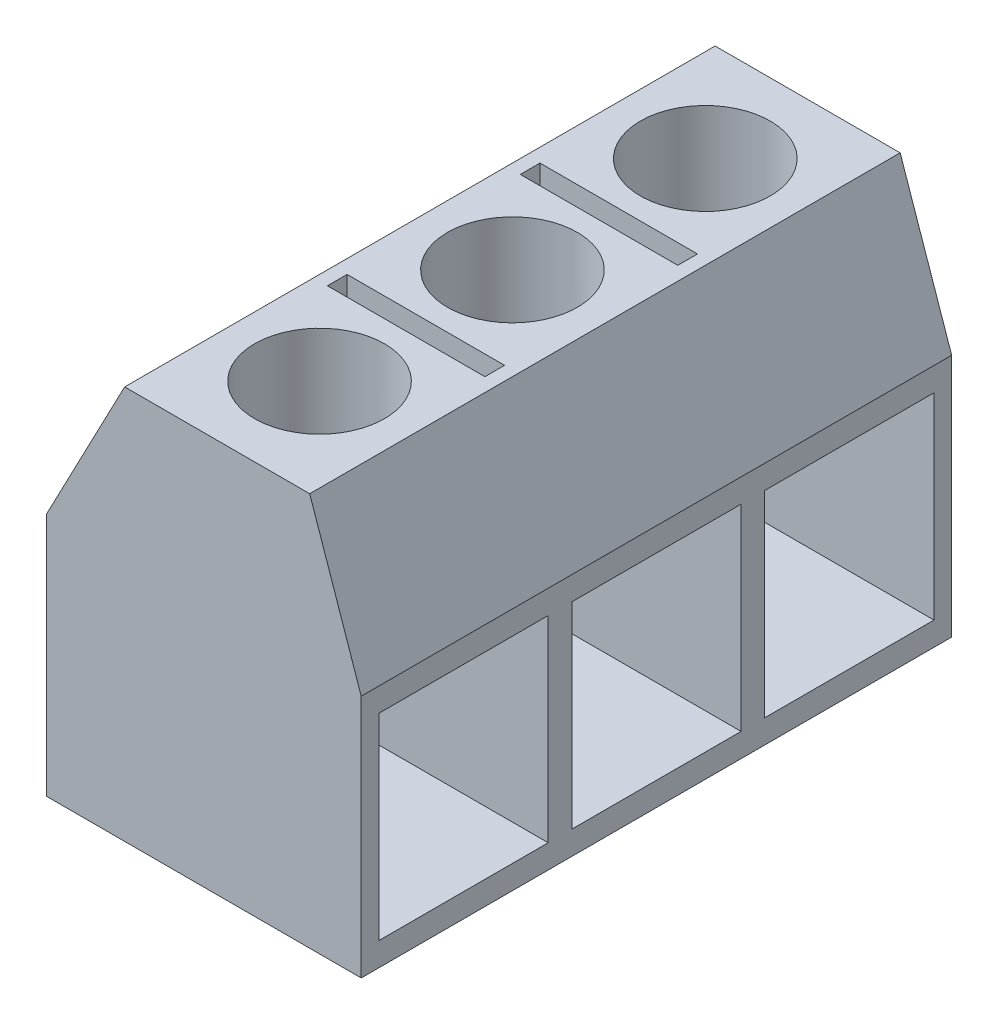
ISO-10303-21;
HEADER;
FILE_DESCRIPTION(('STEP AP214'),'2;1');
FILE_NAME('part.step','',(''),(''),'','','');
FILE_SCHEMA(('AUTOMOTIVE_DESIGN { 1 0 10303 214 1 1 1 1 }'));
ENDSEC;
DATA;
#1=APPLICATION_CONTEXT('core data for automotive mechanical design processes');
#2=APPLICATION_PROTOCOL_DEFINITION('international standard','automotive_design',2000,#1);
#3=PRODUCT_CONTEXT('',#1,'mechanical');
#4=PRODUCT('Part','Part','',(#3));
#5=PRODUCT_RELATED_PRODUCT_CATEGORY('part','',(#4));
#6=PRODUCT_DEFINITION_FORMATION('','',#4);
#7=PRODUCT_DEFINITION_CONTEXT('part definition',#1,'design');
#8=PRODUCT_DEFINITION('design','',#6,#7);
#9=PRODUCT_DEFINITION_SHAPE('','',#8);
#10=(LENGTH_UNIT() NAMED_UNIT(*) SI_UNIT(.MILLI.,.METRE.));
#11=(NAMED_UNIT(*) PLANE_ANGLE_UNIT() SI_UNIT($,.RADIAN.));
#12=(NAMED_UNIT(*) SI_UNIT($,.STERADIAN.) SOLID_ANGLE_UNIT());
#13=UNCERTAINTY_MEASURE_WITH_UNIT(LENGTH_MEASURE(1.E-05),#10,'distance_accuracy_value','');
#14=(GEOMETRIC_REPRESENTATION_CONTEXT(3) GLOBAL_UNCERTAINTY_ASSIGNED_CONTEXT((#13)) GLOBAL_UNIT_ASSIGNED_CONTEXT((#10,
#11,#12)) REPRESENTATION_CONTEXT('',''));
#15=CARTESIAN_POINT('',(0.,0.,0.));
#16=DIRECTION('',(0.,0.,1.));
#17=DIRECTION('',(1.,0.,0.));
#18=AXIS2_PLACEMENT_3D('',#15,#16,#17);
#19=CARTESIAN_POINT('',(-3.80327868852459,6.2,15.));
#20=DIRECTION('',(1.,0.,0.));
#21=DIRECTION('',(0.,1.,0.));
#22=AXIS2_PLACEMENT_3D('',#19,#20,#21);
#23=PLANE('',#22);
#24=DIRECTION('',(0.,-1.,0.));
#25=VECTOR('',#24,1.);
#26=CARTESIAN_POINT('',(-3.80327868852459,6.2,0.));
#27=LINE('',#26,#25);
#28=CARTESIAN_POINT('',(-3.80327868852459,6.2,0.));
#29=VERTEX_POINT('',#28);
#30=CARTESIAN_POINT('',(-3.80327868852458,0.,0.));
#31=VERTEX_POINT('',#30);
#32=EDGE_CURVE('E364',#29,#31,#27,.T.);
#33=ORIENTED_EDGE('',*,*,#32,.T.);
#34=DIRECTION('',(0.,0.,-1.));
#35=VECTOR('',#34,1.);
#36=CARTESIAN_POINT('',(-3.80327868852458,0.,15.));
#37=LINE('',#36,#35);
#38=CARTESIAN_POINT('',(-3.80327868852458,0.,15.));
#39=VERTEX_POINT('',#38);
#40=EDGE_CURVE('E11',#39,#31,#37,.T.);
#41=ORIENTED_EDGE('',*,*,#40,.F.);
#42=DIRECTION('',(0.,-1.,0.));
#43=VECTOR('',#42,1.);
#44=CARTESIAN_POINT('',(-3.80327868852459,6.2,15.));
#45=LINE('',#44,#43);
#46=CARTESIAN_POINT('',(-3.80327868852459,6.2,15.));
#47=VERTEX_POINT('',#46);
#48=EDGE_CURVE('E461',#47,#39,#45,.T.);
#49=ORIENTED_EDGE('',*,*,#48,.F.);
#50=DIRECTION('',(0.,0.,-1.));
#51=VECTOR('',#50,1.);
#52=CARTESIAN_POINT('',(-3.80327868852459,6.2,15.));
#53=LINE('',#52,#51);
#54=EDGE_CURVE('E481',#47,#29,#53,.T.);
#55=ORIENTED_EDGE('',*,*,#54,.T.);
#56=EDGE_LOOP('',(#33,#41,#49,#55));
#57=FACE_BOUND('',#56,.T.);
#58=ADVANCED_FACE('F47',(#57),#23,.F.);
#59=CARTESIAN_POINT('',(-3.80327868852458,0.,15.));
#60=DIRECTION('',(0.,1.,0.));
#61=DIRECTION('',(0.,0.,1.));
#62=AXIS2_PLACEMENT_3D('',#59,#60,#61);
#63=PLANE('',#62);
#64=DIRECTION('',(1.,0.,0.));
#65=VECTOR('',#64,1.);
#66=CARTESIAN_POINT('',(-3.80327868852458,0.,0.));
#67=LINE('',#66,#65);
#68=CARTESIAN_POINT('',(4.19672131147542,0.,0.));
#69=VERTEX_POINT('',#68);
#70=EDGE_CURVE('E485',#31,#69,#67,.T.);
#71=ORIENTED_EDGE('',*,*,#70,.T.);
#72=DIRECTION('',(0.,0.,-1.));
#73=VECTOR('',#72,1.);
#74=CARTESIAN_POINT('',(4.19672131147542,0.,15.));
#75=LINE('',#74,#73);
#76=CARTESIAN_POINT('',(4.19672131147542,0.,15.));
#77=VERTEX_POINT('',#76);
#78=EDGE_CURVE('E56',#77,#69,#75,.T.);
#79=ORIENTED_EDGE('',*,*,#78,.F.);
#80=DIRECTION('',(1.,0.,0.));
#81=VECTOR('',#80,1.);
#82=CARTESIAN_POINT('',(-3.80327868852458,0.,15.));
#83=LINE('',#82,#81);
#84=EDGE_CURVE('E465',#39,#77,#83,.T.);
#85=ORIENTED_EDGE('',*,*,#84,.F.);
#86=ORIENTED_EDGE('',*,*,#40,.T.);
#87=EDGE_LOOP('',(#71,#79,#85,#86));
#88=FACE_BOUND('',#87,.T.);
#89=ADVANCED_FACE('F549',(#88),#63,.F.);
#90=CARTESIAN_POINT('',(4.19672131147542,0.,15.));
#91=DIRECTION('',(-1.,0.,0.));
#92=DIRECTION('',(0.,0.,1.));
#93=AXIS2_PLACEMENT_3D('',#90,#91,#92);
#94=PLANE('',#93);
#95=DIRECTION('',(0.,0.,1.));
#96=VECTOR('',#95,1.);
#97=CARTESIAN_POINT('',(4.19672131147542,5.6,14.55));
#98=LINE('',#97,#96);
#99=CARTESIAN_POINT('',(4.19672131147542,5.6,10.25));
#100=VERTEX_POINT('',#99);
#101=CARTESIAN_POINT('',(4.19672131147542,5.6,14.55));
#102=VERTEX_POINT('',#101);
#103=EDGE_CURVE('E260',#100,#102,#98,.T.);
#104=ORIENTED_EDGE('',*,*,#103,.F.);
#105=DIRECTION('',(0.,1.,0.));
#106=VECTOR('',#105,1.);
#107=CARTESIAN_POINT('',(4.19672131147542,5.6,10.25));
#108=LINE('',#107,#106);
#109=CARTESIAN_POINT('',(4.19672131147542,0.599999999999999,10.25));
#110=VERTEX_POINT('',#109);
#111=EDGE_CURVE('E64',#110,#100,#108,.T.);
#112=ORIENTED_EDGE('',*,*,#111,.F.);
#113=DIRECTION('',(0.,0.,-1.));
#114=VECTOR('',#113,1.);
#115=CARTESIAN_POINT('',(4.19672131147542,0.599999999999999,14.55));
#116=LINE('',#115,#114);
#117=CARTESIAN_POINT('',(4.19672131147542,0.599999999999999,14.55));
#118=VERTEX_POINT('',#117);
#119=EDGE_CURVE('E246',#118,#110,#116,.T.);
#120=ORIENTED_EDGE('',*,*,#119,.F.);
#121=DIRECTION('',(0.,-1.,0.));
#122=VECTOR('',#121,1.);
#123=CARTESIAN_POINT('',(4.19672131147542,5.6,14.55));
#124=LINE('',#123,#122);
#125=EDGE_CURVE('E251',#102,#118,#124,.T.);
#126=ORIENTED_EDGE('',*,*,#125,.F.);
#127=EDGE_LOOP('',(#104,#112,#120,#126));
#128=FACE_BOUND('',#127,.T.);
#129=DIRECTION('',(0.,1.,0.));
#130=VECTOR('',#129,1.);
#131=CARTESIAN_POINT('',(4.19672131147542,5.6,5.35));
#132=LINE('',#131,#130);
#133=CARTESIAN_POINT('',(4.19672131147542,0.6,5.35));
#134=VERTEX_POINT('',#133);
#135=CARTESIAN_POINT('',(4.19672131147542,5.6,5.35));
#136=VERTEX_POINT('',#135);
#137=EDGE_CURVE('E296',#134,#136,#132,.T.);
#138=ORIENTED_EDGE('',*,*,#137,.F.);
#139=DIRECTION('',(0.,0.,-1.));
#140=VECTOR('',#139,1.);
#141=CARTESIAN_POINT('',(4.19672131147542,0.599999999999999,9.65));
#142=LINE('',#141,#140);
#143=CARTESIAN_POINT('',(4.19672131147542,0.599999999999999,9.65));
#144=VERTEX_POINT('',#143);
#145=EDGE_CURVE('E72',#144,#134,#142,.T.);
#146=ORIENTED_EDGE('',*,*,#145,.F.);
#147=DIRECTION('',(0.,-1.,0.));
#148=VECTOR('',#147,1.);
#149=CARTESIAN_POINT('',(4.19672131147542,5.6,9.65));
#150=LINE('',#149,#148);
#151=CARTESIAN_POINT('',(4.19672131147542,5.6,9.65));
#152=VERTEX_POINT('',#151);
#153=EDGE_CURVE('E281',#152,#144,#150,.T.);
#154=ORIENTED_EDGE('',*,*,#153,.F.);
#155=DIRECTION('',(0.,0.,1.));
#156=VECTOR('',#155,1.);
#157=CARTESIAN_POINT('',(4.19672131147542,5.6,9.65));
#158=LINE('',#157,#156);
#159=EDGE_CURVE('E301',#136,#152,#158,.T.);
#160=ORIENTED_EDGE('',*,*,#159,.F.);
#161=EDGE_LOOP('',(#138,#146,#154,#160));
#162=FACE_BOUND('',#161,.T.);
#163=DIRECTION('',(0.,1.,0.));
#164=VECTOR('',#163,1.);
#165=CARTESIAN_POINT('',(4.19672131147542,5.6,0.449999999999996));
#166=LINE('',#165,#164);
#167=CARTESIAN_POINT('',(4.19672131147542,0.599999999999999,0.449999999999996));
#168=VERTEX_POINT('',#167);
#169=CARTESIAN_POINT('',(4.19672131147542,5.6,0.449999999999996));
#170=VERTEX_POINT('',#169);
#171=EDGE_CURVE('E338',#168,#170,#166,.T.);
#172=ORIENTED_EDGE('',*,*,#171,.F.);
#173=DIRECTION('',(0.,0.,-1.));
#174=VECTOR('',#173,1.);
#175=CARTESIAN_POINT('',(4.19672131147542,0.599999999999999,4.75));
#176=LINE('',#175,#174);
#177=CARTESIAN_POINT('',(4.19672131147542,0.599999999999999,4.75));
#178=VERTEX_POINT('',#177);
#179=EDGE_CURVE('E335',#178,#168,#176,.T.);
#180=ORIENTED_EDGE('',*,*,#179,.F.);
#181=DIRECTION('',(0.,-1.,0.));
#182=VECTOR('',#181,1.);
#183=CARTESIAN_POINT('',(4.19672131147542,5.6,4.75));
#184=LINE('',#183,#182);
#185=CARTESIAN_POINT('',(4.19672131147542,5.6,4.75));
#186=VERTEX_POINT('',#185);
#187=EDGE_CURVE('E322',#186,#178,#184,.T.);
#188=ORIENTED_EDGE('',*,*,#187,.F.);
#189=DIRECTION('',(0.,0.,1.));
#190=VECTOR('',#189,1.);
#191=CARTESIAN_POINT('',(4.19672131147542,5.6,4.75));
#192=LINE('',#191,#190);
#193=EDGE_CURVE('E342',#170,#186,#192,.T.);
#194=ORIENTED_EDGE('',*,*,#193,.F.);
#195=EDGE_LOOP('',(#172,#180,#188,#194));
#196=FACE_BOUND('',#195,.T.);
#197=DIRECTION('',(0.,1.,0.));
#198=VECTOR('',#197,1.);
#199=CARTESIAN_POINT('',(4.19672131147542,0.,0.));
#200=LINE('',#199,#198);
#201=CARTESIAN_POINT('',(4.19672131147542,6.2,0.));
#202=VERTEX_POINT('',#201);
#203=EDGE_CURVE('E488',#69,#202,#200,.T.);
#204=ORIENTED_EDGE('',*,*,#203,.T.);
#205=DIRECTION('',(0.,0.,-1.));
#206=VECTOR('',#205,1.);
#207=CARTESIAN_POINT('',(4.19672131147542,6.2,15.));
#208=LINE('',#207,#206);
#209=CARTESIAN_POINT('',(4.19672131147542,6.2,15.));
#210=VERTEX_POINT('',#209);
#211=EDGE_CURVE('E510',#210,#202,#208,.T.);
#212=ORIENTED_EDGE('',*,*,#211,.F.);
#213=DIRECTION('',(0.,1.,0.));
#214=VECTOR('',#213,1.);
#215=CARTESIAN_POINT('',(4.19672131147542,0.,15.));
#216=LINE('',#215,#214);
#217=EDGE_CURVE('E469',#77,#210,#216,.T.);
#218=ORIENTED_EDGE('',*,*,#217,.F.);
#219=ORIENTED_EDGE('',*,*,#78,.T.);
#220=EDGE_LOOP('',(#204,#212,#218,#219));
#221=FACE_BOUND('',#220,.T.);
#222=ADVANCED_FACE('F553',(#128,#162,#196,#221),#94,.F.);
#223=CARTESIAN_POINT('',(4.19672131147542,6.2,15.));
#224=DIRECTION('',(-0.945476419668395,-0.325690558430901,0.));
#225=DIRECTION('',(0.325690558430901,-0.945476419668395,0.));
#226=AXIS2_PLACEMENT_3D('',#223,#224,#225);
#227=PLANE('',#226);
#228=DIRECTION('',(-0.325690558430901,0.945476419668395,0.));
#229=VECTOR('',#228,1.);
#230=CARTESIAN_POINT('',(4.19672131147542,6.2,0.));
#231=LINE('',#230,#229);
#232=CARTESIAN_POINT('',(2.88772608294132,10.,0.));
#233=VERTEX_POINT('',#232);
#234=EDGE_CURVE('E491',#202,#233,#231,.T.);
#235=ORIENTED_EDGE('',*,*,#234,.T.);
#236=DIRECTION('',(0.,0.,-1.));
#237=VECTOR('',#236,1.);
#238=CARTESIAN_POINT('',(2.88772608294132,10.,15.));
#239=LINE('',#238,#237);
#240=CARTESIAN_POINT('',(2.88772608294132,10.,15.));
#241=VERTEX_POINT('',#240);
#242=EDGE_CURVE('E506',#241,#233,#239,.T.);
#243=ORIENTED_EDGE('',*,*,#242,.F.);
#244=DIRECTION('',(-0.325690558430901,0.945476419668395,0.));
#245=VECTOR('',#244,1.);
#246=CARTESIAN_POINT('',(4.19672131147542,6.2,15.));
#247=LINE('',#246,#245);
#248=EDGE_CURVE('E472',#210,#241,#247,.T.);
#249=ORIENTED_EDGE('',*,*,#248,.F.);
#250=ORIENTED_EDGE('',*,*,#211,.T.);
#251=EDGE_LOOP('',(#235,#243,#249,#250));
#252=FACE_BOUND('',#251,.T.);
#253=ADVANCED_FACE('F578',(#252),#227,.F.);
#254=CARTESIAN_POINT('',(2.88772608294132,10.,15.));
#255=DIRECTION('',(0.,-1.,0.));
#256=DIRECTION('',(1.,0.,0.));
#257=AXIS2_PLACEMENT_3D('',#254,#255,#256);
#258=PLANE('',#257);
#259=CARTESIAN_POINT('',(0.537726082941324,10.,12.4));
#260=DIRECTION('',(0.,1.,0.));
#261=DIRECTION('',(-1.,0.,0.));
#262=AXIS2_PLACEMENT_3D('',#259,#260,#261);
#263=CIRCLE('',#262,1.65);
#264=CARTESIAN_POINT('',(-1.11227391705868,10.,12.4));
#265=VERTEX_POINT('',#264);
#266=EDGE_CURVE('E360',#265,#265,#263,.T.);
#267=ORIENTED_EDGE('',*,*,#266,.F.);
#268=EDGE_LOOP('',(#267));
#269=FACE_BOUND('',#268,.T.);
#270=DIRECTION('',(1.,0.,0.));
#271=VECTOR('',#270,1.);
#272=CARTESIAN_POINT('',(-1.46227391705868,10.,10.2));
#273=LINE('',#272,#271);
#274=CARTESIAN_POINT('',(-1.46227391705868,10.,10.2));
#275=VERTEX_POINT('',#274);
#276=CARTESIAN_POINT('',(2.53772608294132,10.,10.2));
#277=VERTEX_POINT('',#276);
#278=EDGE_CURVE('E387',#275,#277,#273,.T.);
#279=ORIENTED_EDGE('',*,*,#278,.F.);
#280=DIRECTION('',(0.,0.,1.));
#281=VECTOR('',#280,1.);
#282=CARTESIAN_POINT('',(-1.46227391705868,10.,10.2));
#283=LINE('',#282,#281);
#284=CARTESIAN_POINT('',(-1.46227391705868,10.,9.7));
#285=VERTEX_POINT('',#284);
#286=EDGE_CURVE('E384',#285,#275,#283,.T.);
#287=ORIENTED_EDGE('',*,*,#286,.F.);
#288=DIRECTION('',(-1.,0.,0.));
#289=VECTOR('',#288,1.);
#290=CARTESIAN_POINT('',(-1.46227391705868,10.,9.7));
#291=LINE('',#290,#289);
#292=CARTESIAN_POINT('',(2.53772608294132,10.,9.7));
#293=VERTEX_POINT('',#292);
#294=EDGE_CURVE('E371',#293,#285,#291,.T.);
#295=ORIENTED_EDGE('',*,*,#294,.F.);
#296=DIRECTION('',(0.,0.,-1.));
#297=VECTOR('',#296,1.);
#298=CARTESIAN_POINT('',(2.53772608294132,10.,10.2));
#299=LINE('',#298,#297);
#300=EDGE_CURVE('E392',#277,#293,#299,.T.);
#301=ORIENTED_EDGE('',*,*,#300,.F.);
#302=EDGE_LOOP('',(#279,#287,#295,#301));
#303=FACE_BOUND('',#302,.T.);
#304=CARTESIAN_POINT('',(0.537726082941324,10.,7.5));
#305=DIRECTION('',(0.,1.,0.));
#306=DIRECTION('',(-1.,0.,0.));
#307=AXIS2_PLACEMENT_3D('',#304,#305,#306);
#308=CIRCLE('',#307,1.65);
#309=CARTESIAN_POINT('',(-1.11227391705868,10.,7.5));
#310=VERTEX_POINT('',#309);
#311=EDGE_CURVE('E388',#310,#310,#308,.T.);
#312=ORIENTED_EDGE('',*,*,#311,.F.);
#313=EDGE_LOOP('',(#312));
#314=FACE_BOUND('',#313,.T.);
#315=DIRECTION('',(1.,0.,0.));
#316=VECTOR('',#315,1.);
#317=CARTESIAN_POINT('',(-1.46227391705868,10.,5.3));
#318=LINE('',#317,#316);
#319=CARTESIAN_POINT('',(-1.46227391705868,10.,5.3));
#320=VERTEX_POINT('',#319);
#321=CARTESIAN_POINT('',(2.53772608294132,10.,5.3));
#322=VERTEX_POINT('',#321);
#323=EDGE_CURVE('E435',#320,#322,#318,.T.);
#324=ORIENTED_EDGE('',*,*,#323,.F.);
#325=DIRECTION('',(0.,0.,1.));
#326=VECTOR('',#325,1.);
#327=CARTESIAN_POINT('',(-1.46227391705868,10.,5.3));
#328=LINE('',#327,#326);
#329=CARTESIAN_POINT('',(-1.46227391705868,10.,4.8));
#330=VERTEX_POINT('',#329);
#331=EDGE_CURVE('E432',#330,#320,#328,.T.);
#332=ORIENTED_EDGE('',*,*,#331,.F.);
#333=DIRECTION('',(-1.,0.,0.));
#334=VECTOR('',#333,1.);
#335=CARTESIAN_POINT('',(-1.46227391705868,10.,4.8));
#336=LINE('',#335,#334);
#337=CARTESIAN_POINT('',(2.53772608294132,10.,4.8));
#338=VERTEX_POINT('',#337);
#339=EDGE_CURVE('E419',#338,#330,#336,.T.);
#340=ORIENTED_EDGE('',*,*,#339,.F.);
#341=DIRECTION('',(0.,0.,-1.));
#342=VECTOR('',#341,1.);
#343=CARTESIAN_POINT('',(2.53772608294132,10.,5.3));
#344=LINE('',#343,#342);
#345=EDGE_CURVE('E440',#322,#338,#344,.T.);
#346=ORIENTED_EDGE('',*,*,#345,.F.);
#347=EDGE_LOOP('',(#324,#332,#340,#346));
#348=FACE_BOUND('',#347,.T.);
#349=CARTESIAN_POINT('',(0.537726082941324,10.,2.6));
#350=DIRECTION('',(0.,1.,0.));
#351=DIRECTION('',(-1.,0.,0.));
#352=AXIS2_PLACEMENT_3D('',#349,#350,#351);
#353=CIRCLE('',#352,1.65);
#354=CARTESIAN_POINT('',(-1.11227391705868,10.,2.6));
#355=VERTEX_POINT('',#354);
#356=EDGE_CURVE('E436',#355,#355,#353,.T.);
#357=ORIENTED_EDGE('',*,*,#356,.F.);
#358=EDGE_LOOP('',(#357));
#359=FACE_BOUND('',#358,.T.);
#360=DIRECTION('',(-1.,0.,0.));
#361=VECTOR('',#360,1.);
#362=CARTESIAN_POINT('',(2.88772608294132,10.,0.));
#363=LINE('',#362,#361);
#364=CARTESIAN_POINT('',(-1.81227391705868,10.,0.));
#365=VERTEX_POINT('',#364);
#366=EDGE_CURVE('E494',#233,#365,#363,.T.);
#367=ORIENTED_EDGE('',*,*,#366,.T.);
#368=DIRECTION('',(0.,0.,-1.));
#369=VECTOR('',#368,1.);
#370=CARTESIAN_POINT('',(-1.81227391705868,10.,15.));
#371=LINE('',#370,#369);
#372=CARTESIAN_POINT('',(-1.81227391705868,10.,15.));
#373=VERTEX_POINT('',#372);
#374=EDGE_CURVE('E502',#373,#365,#371,.T.);
#375=ORIENTED_EDGE('',*,*,#374,.F.);
#376=DIRECTION('',(-1.,0.,0.));
#377=VECTOR('',#376,1.);
#378=CARTESIAN_POINT('',(2.88772608294132,10.,15.));
#379=LINE('',#378,#377);
#380=EDGE_CURVE('E475',#241,#373,#379,.T.);
#381=ORIENTED_EDGE('',*,*,#380,.F.);
#382=ORIENTED_EDGE('',*,*,#242,.T.);
#383=EDGE_LOOP('',(#367,#375,#381,#382));
#384=FACE_BOUND('',#383,.T.);
#385=ADVANCED_FACE('F575',(#269,#303,#314,#348,#359,#384),#258,.F.);
#386=CARTESIAN_POINT('',(-1.81227391705868,10.,15.));
#387=DIRECTION('',(0.885780885780885,-0.46410367633238,0.));
#388=DIRECTION('',(0.46410367633238,0.885780885780885,0.));
#389=AXIS2_PLACEMENT_3D('',#386,#387,#388);
#390=PLANE('',#389);
#391=DIRECTION('',(-0.46410367633238,-0.885780885780885,0.));
#392=VECTOR('',#391,1.);
#393=CARTESIAN_POINT('',(-1.81227391705868,10.,0.));
#394=LINE('',#393,#392);
#395=EDGE_CURVE('E466',#365,#29,#394,.T.);
#396=ORIENTED_EDGE('',*,*,#395,.T.);
#397=ORIENTED_EDGE('',*,*,#54,.F.);
#398=DIRECTION('',(-0.46410367633238,-0.885780885780885,0.));
#399=VECTOR('',#398,1.);
#400=CARTESIAN_POINT('',(-1.81227391705868,10.,15.));
#401=LINE('',#400,#399);
#402=EDGE_CURVE('E478',#373,#47,#401,.T.);
#403=ORIENTED_EDGE('',*,*,#402,.F.);
#404=ORIENTED_EDGE('',*,*,#374,.T.);
#405=EDGE_LOOP('',(#396,#397,#403,#404));
#406=FACE_BOUND('',#405,.T.);
#407=ADVANCED_FACE('F573',(#406),#390,.F.);
#408=CARTESIAN_POINT('',(0.,0.,15.));
#409=DIRECTION('',(0.,0.,1.));
#410=DIRECTION('',(1.,0.,0.));
#411=AXIS2_PLACEMENT_3D('',#408,#409,#410);
#412=PLANE('',#411);
#413=ORIENTED_EDGE('',*,*,#48,.T.);
#414=ORIENTED_EDGE('',*,*,#84,.T.);
#415=ORIENTED_EDGE('',*,*,#217,.T.);
#416=ORIENTED_EDGE('',*,*,#248,.T.);
#417=ORIENTED_EDGE('',*,*,#380,.T.);
#418=ORIENTED_EDGE('',*,*,#402,.T.);
#419=EDGE_LOOP('',(#413,#414,#415,#416,#417,#418));
#420=FACE_BOUND('',#419,.T.);
#421=ADVANCED_FACE('F568',(#420),#412,.T.);
#422=CARTESIAN_POINT('',(0.,0.,0.));
#423=DIRECTION('',(0.,0.,1.));
#424=DIRECTION('',(1.,0.,0.));
#425=AXIS2_PLACEMENT_3D('',#422,#423,#424);
#426=PLANE('',#425);
#427=ORIENTED_EDGE('',*,*,#32,.F.);
#428=ORIENTED_EDGE('',*,*,#395,.F.);
#429=ORIENTED_EDGE('',*,*,#366,.F.);
#430=ORIENTED_EDGE('',*,*,#234,.F.);
#431=ORIENTED_EDGE('',*,*,#203,.F.);
#432=ORIENTED_EDGE('',*,*,#70,.F.);
#433=EDGE_LOOP('',(#427,#428,#429,#430,#431,#432));
#434=FACE_BOUND('',#433,.T.);
#435=ADVANCED_FACE('F561',(#434),#426,.F.);
#436=CARTESIAN_POINT('',(0.537726082941328,0.799999999999999,2.6));
#437=DIRECTION('',(0.,1.,0.));
#438=DIRECTION('',(-1.,0.,0.));
#439=AXIS2_PLACEMENT_3D('',#436,#437,#438);
#440=CYLINDRICAL_SURFACE('',#439,1.65);
#441=CARTESIAN_POINT('',(0.537726082941326,5.6,2.6));
#442=DIRECTION('',(0.,1.,0.));
#443=DIRECTION('',(0.,0.,1.));
#444=AXIS2_PLACEMENT_3D('',#441,#442,#443);
#445=CIRCLE('',#444,1.65);
#446=CARTESIAN_POINT('',(0.537726082941326,5.6,4.25));
#447=VERTEX_POINT('',#446);
#448=EDGE_CURVE('E50',#447,#447,#445,.F.);
#449=ORIENTED_EDGE('',*,*,#448,.T.);
#450=EDGE_LOOP('',(#449));
#451=FACE_BOUND('',#450,.T.);
#452=ORIENTED_EDGE('',*,*,#356,.T.);
#453=EDGE_LOOP('',(#452));
#454=FACE_BOUND('',#453,.T.);
#455=ADVANCED_FACE('F528',(#451,#454),#440,.F.);
#456=CARTESIAN_POINT('',(-1.46227391705867,0.799999999999999,5.3));
#457=DIRECTION('',(-1.,0.,0.));
#458=DIRECTION('',(0.,-1.,0.));
#459=AXIS2_PLACEMENT_3D('',#456,#457,#458);
#460=PLANE('',#459);
#461=ORIENTED_EDGE('',*,*,#331,.T.);
#462=DIRECTION('',(0.,1.,0.));
#463=VECTOR('',#462,1.);
#464=CARTESIAN_POINT('',(-1.46227391705867,0.799999999999999,5.3));
#465=LINE('',#464,#463);
#466=CARTESIAN_POINT('',(-1.46227391705867,0.799999999999999,5.3));
#467=VERTEX_POINT('',#466);
#468=EDGE_CURVE('E431',#467,#320,#465,.T.);
#469=ORIENTED_EDGE('',*,*,#468,.F.);
#470=DIRECTION('',(0.,0.,1.));
#471=VECTOR('',#470,1.);
#472=CARTESIAN_POINT('',(-1.46227391705867,0.799999999999999,5.3));
#473=LINE('',#472,#471);
#474=CARTESIAN_POINT('',(-1.46227391705867,0.799999999999999,4.8));
#475=VERTEX_POINT('',#474);
#476=EDGE_CURVE('E414',#475,#467,#473,.T.);
#477=ORIENTED_EDGE('',*,*,#476,.F.);
#478=DIRECTION('',(0.,1.,0.));
#479=VECTOR('',#478,1.);
#480=CARTESIAN_POINT('',(-1.46227391705867,0.799999999999999,4.8));
#481=LINE('',#480,#479);
#482=EDGE_CURVE('E413',#475,#330,#481,.T.);
#483=ORIENTED_EDGE('',*,*,#482,.T.);
#484=EDGE_LOOP('',(#461,#469,#477,#483));
#485=FACE_BOUND('',#484,.T.);
#486=ADVANCED_FACE('F601',(#485),#460,.F.);
#487=CARTESIAN_POINT('',(-1.46227391705867,0.799999999999999,4.8));
#488=DIRECTION('',(0.,0.,-1.));
#489=DIRECTION('',(-1.,0.,0.));
#490=AXIS2_PLACEMENT_3D('',#487,#488,#489);
#491=PLANE('',#490);
#492=ORIENTED_EDGE('',*,*,#339,.T.);
#493=ORIENTED_EDGE('',*,*,#482,.F.);
#494=DIRECTION('',(-1.,0.,0.));
#495=VECTOR('',#494,1.);
#496=CARTESIAN_POINT('',(-1.46227391705867,0.799999999999999,4.8));
#497=LINE('',#496,#495);
#498=CARTESIAN_POINT('',(2.53772608294133,0.8,4.8));
#499=VERTEX_POINT('',#498);
#500=EDGE_CURVE('E427',#499,#475,#497,.T.);
#501=ORIENTED_EDGE('',*,*,#500,.F.);
#502=DIRECTION('',(0.,1.,0.));
#503=VECTOR('',#502,1.);
#504=CARTESIAN_POINT('',(2.53772608294133,0.8,4.8));
#505=LINE('',#504,#503);
#506=EDGE_CURVE('E449',#499,#338,#505,.T.);
#507=ORIENTED_EDGE('',*,*,#506,.T.);
#508=EDGE_LOOP('',(#492,#493,#501,#507));
#509=FACE_BOUND('',#508,.T.);
#510=ADVANCED_FACE('F604',(#509),#491,.F.);
#511=CARTESIAN_POINT('',(2.53772608294133,0.8,5.3));
#512=DIRECTION('',(1.,0.,0.));
#513=DIRECTION('',(0.,1.,0.));
#514=AXIS2_PLACEMENT_3D('',#511,#512,#513);
#515=PLANE('',#514);
#516=ORIENTED_EDGE('',*,*,#345,.T.);
#517=ORIENTED_EDGE('',*,*,#506,.F.);
#518=DIRECTION('',(0.,0.,-1.));
#519=VECTOR('',#518,1.);
#520=CARTESIAN_POINT('',(2.53772608294133,0.8,5.3));
#521=LINE('',#520,#519);
#522=CARTESIAN_POINT('',(2.53772608294133,0.8,5.3));
#523=VERTEX_POINT('',#522);
#524=EDGE_CURVE('E423',#523,#499,#521,.T.);
#525=ORIENTED_EDGE('',*,*,#524,.F.);
#526=DIRECTION('',(0.,1.,0.));
#527=VECTOR('',#526,1.);
#528=CARTESIAN_POINT('',(2.53772608294133,0.8,5.3));
#529=LINE('',#528,#527);
#530=EDGE_CURVE('E452',#523,#322,#529,.T.);
#531=ORIENTED_EDGE('',*,*,#530,.T.);
#532=EDGE_LOOP('',(#516,#517,#525,#531));
#533=FACE_BOUND('',#532,.T.);
#534=ADVANCED_FACE('F610',(#533),#515,.F.);
#535=CARTESIAN_POINT('',(-1.46227391705867,0.799999999999999,5.3));
#536=DIRECTION('',(0.,0.,1.));
#537=DIRECTION('',(1.,0.,0.));
#538=AXIS2_PLACEMENT_3D('',#535,#536,#537);
#539=PLANE('',#538);
#540=ORIENTED_EDGE('',*,*,#323,.T.);
#541=ORIENTED_EDGE('',*,*,#530,.F.);
#542=DIRECTION('',(1.,0.,0.));
#543=VECTOR('',#542,1.);
#544=CARTESIAN_POINT('',(-1.46227391705867,0.799999999999999,5.3));
#545=LINE('',#544,#543);
#546=EDGE_CURVE('E418',#467,#523,#545,.T.);
#547=ORIENTED_EDGE('',*,*,#546,.F.);
#548=ORIENTED_EDGE('',*,*,#468,.T.);
#549=EDGE_LOOP('',(#540,#541,#547,#548));
#550=FACE_BOUND('',#549,.T.);
#551=ADVANCED_FACE('F606',(#550),#539,.F.);
#552=CARTESIAN_POINT('',(0.,0.799999999999999,0.));
#553=DIRECTION('',(0.,-1.,0.));
#554=DIRECTION('',(1.,0.,0.));
#555=AXIS2_PLACEMENT_3D('',#552,#553,#554);
#556=PLANE('',#555);
#557=ORIENTED_EDGE('',*,*,#476,.T.);
#558=ORIENTED_EDGE('',*,*,#546,.T.);
#559=ORIENTED_EDGE('',*,*,#524,.T.);
#560=ORIENTED_EDGE('',*,*,#500,.T.);
#561=EDGE_LOOP('',(#557,#558,#559,#560));
#562=FACE_BOUND('',#561,.T.);
#563=ADVANCED_FACE('F609',(#562),#556,.F.);
#564=CARTESIAN_POINT('',(0.537726082941328,0.799999999999999,7.5));
#565=DIRECTION('',(0.,1.,0.));
#566=DIRECTION('',(-1.,0.,0.));
#567=AXIS2_PLACEMENT_3D('',#564,#565,#566);
#568=CYLINDRICAL_SURFACE('',#567,1.65);
#569=CARTESIAN_POINT('',(0.537726082941326,5.6,7.5));
#570=DIRECTION('',(0.,1.,0.));
#571=DIRECTION('',(0.,0.,1.));
#572=AXIS2_PLACEMENT_3D('',#569,#570,#571);
#573=CIRCLE('',#572,1.65);
#574=CARTESIAN_POINT('',(0.537726082941326,5.6,9.15));
#575=VERTEX_POINT('',#574);
#576=EDGE_CURVE('E519',#575,#575,#573,.F.);
#577=ORIENTED_EDGE('',*,*,#576,.T.);
#578=EDGE_LOOP('',(#577));
#579=FACE_BOUND('',#578,.T.);
#580=ORIENTED_EDGE('',*,*,#311,.T.);
#581=EDGE_LOOP('',(#580));
#582=FACE_BOUND('',#581,.T.);
#583=ADVANCED_FACE('F620',(#579,#582),#568,.F.);
#584=CARTESIAN_POINT('',(-1.46227391705867,0.799999999999999,10.2));
#585=DIRECTION('',(-1.,0.,0.));
#586=DIRECTION('',(0.,-1.,0.));
#587=AXIS2_PLACEMENT_3D('',#584,#585,#586);
#588=PLANE('',#587);
#589=ORIENTED_EDGE('',*,*,#286,.T.);
#590=DIRECTION('',(0.,1.,0.));
#591=VECTOR('',#590,1.);
#592=CARTESIAN_POINT('',(-1.46227391705867,0.799999999999999,10.2));
#593=LINE('',#592,#591);
#594=CARTESIAN_POINT('',(-1.46227391705867,0.799999999999999,10.2));
#595=VERTEX_POINT('',#594);
#596=EDGE_CURVE('E383',#595,#275,#593,.T.);
#597=ORIENTED_EDGE('',*,*,#596,.F.);
#598=DIRECTION('',(0.,0.,1.));
#599=VECTOR('',#598,1.);
#600=CARTESIAN_POINT('',(-1.46227391705867,0.799999999999999,10.2));
#601=LINE('',#600,#599);
#602=CARTESIAN_POINT('',(-1.46227391705867,0.799999999999999,9.7));
#603=VERTEX_POINT('',#602);
#604=EDGE_CURVE('E366',#603,#595,#601,.T.);
#605=ORIENTED_EDGE('',*,*,#604,.F.);
#606=DIRECTION('',(0.,1.,0.));
#607=VECTOR('',#606,1.);
#608=CARTESIAN_POINT('',(-1.46227391705867,0.799999999999999,9.7));
#609=LINE('',#608,#607);
#610=EDGE_CURVE('E365',#603,#285,#609,.T.);
#611=ORIENTED_EDGE('',*,*,#610,.T.);
#612=EDGE_LOOP('',(#589,#597,#605,#611));
#613=FACE_BOUND('',#612,.T.);
#614=ADVANCED_FACE('F624',(#613),#588,.F.);
#615=CARTESIAN_POINT('',(-1.46227391705867,0.799999999999999,9.7));
#616=DIRECTION('',(0.,0.,-1.));
#617=DIRECTION('',(-1.,0.,0.));
#618=AXIS2_PLACEMENT_3D('',#615,#616,#617);
#619=PLANE('',#618);
#620=ORIENTED_EDGE('',*,*,#294,.T.);
#621=ORIENTED_EDGE('',*,*,#610,.F.);
#622=DIRECTION('',(-1.,0.,0.));
#623=VECTOR('',#622,1.);
#624=CARTESIAN_POINT('',(-1.46227391705867,0.799999999999999,9.7));
#625=LINE('',#624,#623);
#626=CARTESIAN_POINT('',(2.53772608294133,0.8,9.7));
#627=VERTEX_POINT('',#626);
#628=EDGE_CURVE('E379',#627,#603,#625,.T.);
#629=ORIENTED_EDGE('',*,*,#628,.F.);
#630=DIRECTION('',(0.,1.,0.));
#631=VECTOR('',#630,1.);
#632=CARTESIAN_POINT('',(2.53772608294133,0.8,9.7));
#633=LINE('',#632,#631);
#634=EDGE_CURVE('E401',#627,#293,#633,.T.);
#635=ORIENTED_EDGE('',*,*,#634,.T.);
#636=EDGE_LOOP('',(#620,#621,#629,#635));
#637=FACE_BOUND('',#636,.T.);
#638=ADVANCED_FACE('F627',(#637),#619,.F.);
#639=CARTESIAN_POINT('',(2.53772608294133,0.8,10.2));
#640=DIRECTION('',(1.,0.,0.));
#641=DIRECTION('',(0.,1.,0.));
#642=AXIS2_PLACEMENT_3D('',#639,#640,#641);
#643=PLANE('',#642);
#644=ORIENTED_EDGE('',*,*,#300,.T.);
#645=ORIENTED_EDGE('',*,*,#634,.F.);
#646=DIRECTION('',(0.,0.,-1.));
#647=VECTOR('',#646,1.);
#648=CARTESIAN_POINT('',(2.53772608294133,0.8,10.2));
#649=LINE('',#648,#647);
#650=CARTESIAN_POINT('',(2.53772608294133,0.8,10.2));
#651=VERTEX_POINT('',#650);
#652=EDGE_CURVE('E375',#651,#627,#649,.T.);
#653=ORIENTED_EDGE('',*,*,#652,.F.);
#654=DIRECTION('',(0.,1.,0.));
#655=VECTOR('',#654,1.);
#656=CARTESIAN_POINT('',(2.53772608294133,0.8,10.2));
#657=LINE('',#656,#655);
#658=EDGE_CURVE('E404',#651,#277,#657,.T.);
#659=ORIENTED_EDGE('',*,*,#658,.T.);
#660=EDGE_LOOP('',(#644,#645,#653,#659));
#661=FACE_BOUND('',#660,.T.);
#662=ADVANCED_FACE('F633',(#661),#643,.F.);
#663=CARTESIAN_POINT('',(-1.46227391705867,0.799999999999999,10.2));
#664=DIRECTION('',(0.,0.,1.));
#665=DIRECTION('',(1.,0.,0.));
#666=AXIS2_PLACEMENT_3D('',#663,#664,#665);
#667=PLANE('',#666);
#668=ORIENTED_EDGE('',*,*,#278,.T.);
#669=ORIENTED_EDGE('',*,*,#658,.F.);
#670=DIRECTION('',(1.,0.,0.));
#671=VECTOR('',#670,1.);
#672=CARTESIAN_POINT('',(-1.46227391705867,0.799999999999999,10.2));
#673=LINE('',#672,#671);
#674=EDGE_CURVE('E370',#595,#651,#673,.T.);
#675=ORIENTED_EDGE('',*,*,#674,.F.);
#676=ORIENTED_EDGE('',*,*,#596,.T.);
#677=EDGE_LOOP('',(#668,#669,#675,#676));
#678=FACE_BOUND('',#677,.T.);
#679=ADVANCED_FACE('F629',(#678),#667,.F.);
#680=CARTESIAN_POINT('',(0.,0.799999999999999,0.));
#681=DIRECTION('',(0.,-1.,0.));
#682=DIRECTION('',(1.,0.,0.));
#683=AXIS2_PLACEMENT_3D('',#680,#681,#682);
#684=PLANE('',#683);
#685=ORIENTED_EDGE('',*,*,#604,.T.);
#686=ORIENTED_EDGE('',*,*,#674,.T.);
#687=ORIENTED_EDGE('',*,*,#652,.T.);
#688=ORIENTED_EDGE('',*,*,#628,.T.);
#689=EDGE_LOOP('',(#685,#686,#687,#688));
#690=FACE_BOUND('',#689,.T.);
#691=ADVANCED_FACE('F632',(#690),#684,.F.);
#692=CARTESIAN_POINT('',(0.537726082941328,0.799999999999999,12.4));
#693=DIRECTION('',(0.,1.,0.));
#694=DIRECTION('',(-1.,0.,0.));
#695=AXIS2_PLACEMENT_3D('',#692,#693,#694);
#696=CYLINDRICAL_SURFACE('',#695,1.65);
#697=CARTESIAN_POINT('',(0.537726082941326,5.6,12.4));
#698=DIRECTION('',(0.,1.,0.));
#699=DIRECTION('',(0.,0.,1.));
#700=AXIS2_PLACEMENT_3D('',#697,#698,#699);
#701=CIRCLE('',#700,1.65);
#702=CARTESIAN_POINT('',(0.537726082941326,5.6,14.05));
#703=VERTEX_POINT('',#702);
#704=EDGE_CURVE('E270',#703,#703,#701,.F.);
#705=ORIENTED_EDGE('',*,*,#704,.T.);
#706=EDGE_LOOP('',(#705));
#707=FACE_BOUND('',#706,.T.);
#708=ORIENTED_EDGE('',*,*,#266,.T.);
#709=EDGE_LOOP('',(#708));
#710=FACE_BOUND('',#709,.T.);
#711=ADVANCED_FACE('F643',(#707,#710),#696,.F.);
#712=CARTESIAN_POINT('',(-1.80327868852458,5.6,14.55));
#713=DIRECTION('',(0.,1.,0.));
#714=DIRECTION('',(0.,0.,1.));
#715=AXIS2_PLACEMENT_3D('',#712,#713,#714);
#716=PLANE('',#715);
#717=ORIENTED_EDGE('',*,*,#103,.T.);
#718=DIRECTION('',(1.,0.,0.));
#719=VECTOR('',#718,1.);
#720=CARTESIAN_POINT('',(-1.80327868852458,5.6,14.55));
#721=LINE('',#720,#719);
#722=CARTESIAN_POINT('',(-1.80327868852458,5.6,14.55));
#723=VERTEX_POINT('',#722);
#724=EDGE_CURVE('E230',#723,#102,#721,.T.);
#725=ORIENTED_EDGE('',*,*,#724,.F.);
#726=DIRECTION('',(0.,0.,1.));
#727=VECTOR('',#726,1.);
#728=CARTESIAN_POINT('',(-1.80327868852458,5.6,14.55));
#729=LINE('',#728,#727);
#730=CARTESIAN_POINT('',(-1.80327868852458,5.6,10.25));
#731=VERTEX_POINT('',#730);
#732=EDGE_CURVE('E234',#731,#723,#729,.T.);
#733=ORIENTED_EDGE('',*,*,#732,.F.);
#734=DIRECTION('',(1.,0.,0.));
#735=VECTOR('',#734,1.);
#736=CARTESIAN_POINT('',(-1.80327868852458,5.6,10.25));
#737=LINE('',#736,#735);
#738=EDGE_CURVE('E220',#731,#100,#737,.T.);
#739=ORIENTED_EDGE('',*,*,#738,.T.);
#740=EDGE_LOOP('',(#717,#725,#733,#739));
#741=FACE_BOUND('',#740,.T.);
#742=ORIENTED_EDGE('',*,*,#704,.F.);
#743=EDGE_LOOP('',(#742));
#744=FACE_BOUND('',#743,.T.);
#745=ADVANCED_FACE('F235',(#741,#744),#716,.F.);
#746=CARTESIAN_POINT('',(-1.80327868852458,5.6,10.25));
#747=DIRECTION('',(0.,0.,-1.));
#748=DIRECTION('',(-1.,0.,0.));
#749=AXIS2_PLACEMENT_3D('',#746,#747,#748);
#750=PLANE('',#749);
#751=ORIENTED_EDGE('',*,*,#111,.T.);
#752=ORIENTED_EDGE('',*,*,#738,.F.);
#753=DIRECTION('',(0.,1.,0.));
#754=VECTOR('',#753,1.);
#755=CARTESIAN_POINT('',(-1.80327868852458,5.6,10.25));
#756=LINE('',#755,#754);
#757=CARTESIAN_POINT('',(-1.80327868852458,0.599999999999999,10.25));
#758=VERTEX_POINT('',#757);
#759=EDGE_CURVE('E224',#758,#731,#756,.T.);
#760=ORIENTED_EDGE('',*,*,#759,.F.);
#761=DIRECTION('',(1.,0.,0.));
#762=VECTOR('',#761,1.);
#763=CARTESIAN_POINT('',(-1.80327868852458,0.599999999999999,10.25));
#764=LINE('',#763,#762);
#765=EDGE_CURVE('E267',#758,#110,#764,.T.);
#766=ORIENTED_EDGE('',*,*,#765,.T.);
#767=EDGE_LOOP('',(#751,#752,#760,#766));
#768=FACE_BOUND('',#767,.T.);
#769=ADVANCED_FACE('F222',(#768),#750,.F.);
#770=CARTESIAN_POINT('',(-1.80327868852458,0.599999999999999,14.55));
#771=DIRECTION('',(0.,-1.,0.));
#772=DIRECTION('',(0.,0.,-1.));
#773=AXIS2_PLACEMENT_3D('',#770,#771,#772);
#774=PLANE('',#773);
#775=ORIENTED_EDGE('',*,*,#119,.T.);
#776=ORIENTED_EDGE('',*,*,#765,.F.);
#777=DIRECTION('',(0.,0.,-1.));
#778=VECTOR('',#777,1.);
#779=CARTESIAN_POINT('',(-1.80327868852458,0.599999999999999,14.55));
#780=LINE('',#779,#778);
#781=CARTESIAN_POINT('',(-1.80327868852458,0.599999999999999,14.55));
#782=VERTEX_POINT('',#781);
#783=EDGE_CURVE('E231',#782,#758,#780,.T.);
#784=ORIENTED_EDGE('',*,*,#783,.F.);
#785=DIRECTION('',(1.,0.,0.));
#786=VECTOR('',#785,1.);
#787=CARTESIAN_POINT('',(-1.80327868852458,0.599999999999999,14.55));
#788=LINE('',#787,#786);
#789=EDGE_CURVE('E271',#782,#118,#788,.T.);
#790=ORIENTED_EDGE('',*,*,#789,.T.);
#791=EDGE_LOOP('',(#775,#776,#784,#790));
#792=FACE_BOUND('',#791,.T.);
#793=ADVANCED_FACE('F684',(#792),#774,.F.);
#794=CARTESIAN_POINT('',(-1.80327868852458,5.6,14.55));
#795=DIRECTION('',(0.,0.,1.));
#796=DIRECTION('',(1.,0.,0.));
#797=AXIS2_PLACEMENT_3D('',#794,#795,#796);
#798=PLANE('',#797);
#799=ORIENTED_EDGE('',*,*,#125,.T.);
#800=ORIENTED_EDGE('',*,*,#789,.F.);
#801=DIRECTION('',(0.,-1.,0.));
#802=VECTOR('',#801,1.);
#803=CARTESIAN_POINT('',(-1.80327868852458,5.6,14.55));
#804=LINE('',#803,#802);
#805=EDGE_CURVE('E241',#723,#782,#804,.T.);
#806=ORIENTED_EDGE('',*,*,#805,.F.);
#807=ORIENTED_EDGE('',*,*,#724,.T.);
#808=EDGE_LOOP('',(#799,#800,#806,#807));
#809=FACE_BOUND('',#808,.T.);
#810=ADVANCED_FACE('F687',(#809),#798,.F.);
#811=CARTESIAN_POINT('',(-1.80327868852458,0.,0.));
#812=DIRECTION('',(1.,0.,0.));
#813=DIRECTION('',(0.,0.,-1.));
#814=AXIS2_PLACEMENT_3D('',#811,#812,#813);
#815=PLANE('',#814);
#816=ORIENTED_EDGE('',*,*,#759,.T.);
#817=ORIENTED_EDGE('',*,*,#732,.T.);
#818=ORIENTED_EDGE('',*,*,#805,.T.);
#819=ORIENTED_EDGE('',*,*,#783,.T.);
#820=EDGE_LOOP('',(#816,#817,#818,#819));
#821=FACE_BOUND('',#820,.T.);
#822=ADVANCED_FACE('F243',(#821),#815,.T.);
#823=CARTESIAN_POINT('',(-1.80327868852458,5.6,9.65));
#824=DIRECTION('',(0.,1.,0.));
#825=DIRECTION('',(0.,0.,1.));
#826=AXIS2_PLACEMENT_3D('',#823,#824,#825);
#827=PLANE('',#826);
#828=ORIENTED_EDGE('',*,*,#159,.T.);
#829=DIRECTION('',(1.,0.,0.));
#830=VECTOR('',#829,1.);
#831=CARTESIAN_POINT('',(-1.80327868852458,5.6,9.65));
#832=LINE('',#831,#830);
#833=CARTESIAN_POINT('',(-1.80327868852458,5.6,9.65));
#834=VERTEX_POINT('',#833);
#835=EDGE_CURVE('E310',#834,#152,#832,.T.);
#836=ORIENTED_EDGE('',*,*,#835,.F.);
#837=DIRECTION('',(0.,0.,1.));
#838=VECTOR('',#837,1.);
#839=CARTESIAN_POINT('',(-1.80327868852458,5.6,9.65));
#840=LINE('',#839,#838);
#841=CARTESIAN_POINT('',(-1.80327868852458,5.6,5.35));
#842=VERTEX_POINT('',#841);
#843=EDGE_CURVE('E285',#842,#834,#840,.T.);
#844=ORIENTED_EDGE('',*,*,#843,.F.);
#845=DIRECTION('',(1.,0.,0.));
#846=VECTOR('',#845,1.);
#847=CARTESIAN_POINT('',(-1.80327868852458,5.6,5.35));
#848=LINE('',#847,#846);
#849=EDGE_CURVE('E313',#842,#136,#848,.T.);
#850=ORIENTED_EDGE('',*,*,#849,.T.);
#851=EDGE_LOOP('',(#828,#836,#844,#850));
#852=FACE_BOUND('',#851,.T.);
#853=ORIENTED_EDGE('',*,*,#576,.F.);
#854=EDGE_LOOP('',(#853));
#855=FACE_BOUND('',#854,.T.);
#856=ADVANCED_FACE('F672',(#852,#855),#827,.F.);
#857=CARTESIAN_POINT('',(-1.80327868852458,0.599999999999999,9.65));
#858=DIRECTION('',(0.,-1.,0.));
#859=DIRECTION('',(0.,0.,-1.));
#860=AXIS2_PLACEMENT_3D('',#857,#858,#859);
#861=PLANE('',#860);
#862=ORIENTED_EDGE('',*,*,#145,.T.);
#863=DIRECTION('',(1.,0.,0.));
#864=VECTOR('',#863,1.);
#865=CARTESIAN_POINT('',(-1.80327868852458,0.6,5.35));
#866=LINE('',#865,#864);
#867=CARTESIAN_POINT('',(-1.80327868852458,0.6,5.35));
#868=VERTEX_POINT('',#867);
#869=EDGE_CURVE('E293',#868,#134,#866,.T.);
#870=ORIENTED_EDGE('',*,*,#869,.F.);
#871=DIRECTION('',(0.,0.,-1.));
#872=VECTOR('',#871,1.);
#873=CARTESIAN_POINT('',(-1.80327868852458,0.599999999999999,9.65));
#874=LINE('',#873,#872);
#875=CARTESIAN_POINT('',(-1.80327868852458,0.599999999999999,9.65));
#876=VERTEX_POINT('',#875);
#877=EDGE_CURVE('E276',#876,#868,#874,.T.);
#878=ORIENTED_EDGE('',*,*,#877,.F.);
#879=DIRECTION('',(1.,0.,0.));
#880=VECTOR('',#879,1.);
#881=CARTESIAN_POINT('',(-1.80327868852458,0.599999999999999,9.65));
#882=LINE('',#881,#880);
#883=EDGE_CURVE('E261',#876,#144,#882,.T.);
#884=ORIENTED_EDGE('',*,*,#883,.T.);
#885=EDGE_LOOP('',(#862,#870,#878,#884));
#886=FACE_BOUND('',#885,.T.);
#887=ADVANCED_FACE('F668',(#886),#861,.F.);
#888=CARTESIAN_POINT('',(-1.80327868852458,5.6,9.65));
#889=DIRECTION('',(0.,0.,1.));
#890=DIRECTION('',(0.,-1.,0.));
#891=AXIS2_PLACEMENT_3D('',#888,#889,#890);
#892=PLANE('',#891);
#893=ORIENTED_EDGE('',*,*,#153,.T.);
#894=ORIENTED_EDGE('',*,*,#883,.F.);
#895=DIRECTION('',(0.,-1.,0.));
#896=VECTOR('',#895,1.);
#897=CARTESIAN_POINT('',(-1.80327868852458,5.6,9.65));
#898=LINE('',#897,#896);
#899=EDGE_CURVE('E289',#834,#876,#898,.T.);
#900=ORIENTED_EDGE('',*,*,#899,.F.);
#901=ORIENTED_EDGE('',*,*,#835,.T.);
#902=EDGE_LOOP('',(#893,#894,#900,#901));
#903=FACE_BOUND('',#902,.T.);
#904=ADVANCED_FACE('F671',(#903),#892,.F.);
#905=CARTESIAN_POINT('',(-1.80327868852458,5.6,5.35));
#906=DIRECTION('',(0.,0.,-1.));
#907=DIRECTION('',(0.,1.,0.));
#908=AXIS2_PLACEMENT_3D('',#905,#906,#907);
#909=PLANE('',#908);
#910=ORIENTED_EDGE('',*,*,#137,.T.);
#911=ORIENTED_EDGE('',*,*,#849,.F.);
#912=DIRECTION('',(0.,1.,0.));
#913=VECTOR('',#912,1.);
#914=CARTESIAN_POINT('',(-1.80327868852458,5.6,5.35));
#915=LINE('',#914,#913);
#916=EDGE_CURVE('E280',#868,#842,#915,.T.);
#917=ORIENTED_EDGE('',*,*,#916,.F.);
#918=ORIENTED_EDGE('',*,*,#869,.T.);
#919=EDGE_LOOP('',(#910,#911,#917,#918));
#920=FACE_BOUND('',#919,.T.);
#921=ADVANCED_FACE('F543',(#920),#909,.F.);
#922=CARTESIAN_POINT('',(-1.80327868852458,0.,0.));
#923=DIRECTION('',(-1.,0.,0.));
#924=DIRECTION('',(0.,0.,1.));
#925=AXIS2_PLACEMENT_3D('',#922,#923,#924);
#926=PLANE('',#925);
#927=ORIENTED_EDGE('',*,*,#877,.T.);
#928=ORIENTED_EDGE('',*,*,#916,.T.);
#929=ORIENTED_EDGE('',*,*,#843,.T.);
#930=ORIENTED_EDGE('',*,*,#899,.T.);
#931=EDGE_LOOP('',(#927,#928,#929,#930));
#932=FACE_BOUND('',#931,.T.);
#933=ADVANCED_FACE('F534',(#932),#926,.F.);
#934=CARTESIAN_POINT('',(-1.80327868852458,5.6,4.75));
#935=DIRECTION('',(0.,1.,0.));
#936=DIRECTION('',(0.,0.,1.));
#937=AXIS2_PLACEMENT_3D('',#934,#935,#936);
#938=PLANE('',#937);
#939=ORIENTED_EDGE('',*,*,#193,.T.);
#940=DIRECTION('',(1.,0.,0.));
#941=VECTOR('',#940,1.);
#942=CARTESIAN_POINT('',(-1.80327868852458,5.6,4.75));
#943=LINE('',#942,#941);
#944=CARTESIAN_POINT('',(-1.80327868852458,5.6,4.75));
#945=VERTEX_POINT('',#944);
#946=EDGE_CURVE('E351',#945,#186,#943,.T.);
#947=ORIENTED_EDGE('',*,*,#946,.F.);
#948=DIRECTION('',(0.,0.,1.));
#949=VECTOR('',#948,1.);
#950=CARTESIAN_POINT('',(-1.80327868852458,5.6,4.75));
#951=LINE('',#950,#949);
#952=CARTESIAN_POINT('',(-1.80327868852458,5.6,0.449999999999996));
#953=VERTEX_POINT('',#952);
#954=EDGE_CURVE('E326',#953,#945,#951,.T.);
#955=ORIENTED_EDGE('',*,*,#954,.F.);
#956=DIRECTION('',(1.,0.,0.));
#957=VECTOR('',#956,1.);
#958=CARTESIAN_POINT('',(-1.80327868852458,5.6,0.449999999999996));
#959=LINE('',#958,#957);
#960=EDGE_CURVE('E354',#953,#170,#959,.T.);
#961=ORIENTED_EDGE('',*,*,#960,.T.);
#962=EDGE_LOOP('',(#939,#947,#955,#961));
#963=FACE_BOUND('',#962,.T.);
#964=ORIENTED_EDGE('',*,*,#448,.F.);
#965=EDGE_LOOP('',(#964));
#966=FACE_BOUND('',#965,.T.);
#967=ADVANCED_FACE('F531',(#963,#966),#938,.F.);
#968=CARTESIAN_POINT('',(-1.80327868852458,0.599999999999999,4.75));
#969=DIRECTION('',(0.,-1.,0.));
#970=DIRECTION('',(0.,0.,-1.));
#971=AXIS2_PLACEMENT_3D('',#968,#969,#970);
#972=PLANE('',#971);
#973=ORIENTED_EDGE('',*,*,#179,.T.);
#974=DIRECTION('',(1.,0.,0.));
#975=VECTOR('',#974,1.);
#976=CARTESIAN_POINT('',(-1.80327868852458,0.599999999999999,0.449999999999996));
#977=LINE('',#976,#975);
#978=CARTESIAN_POINT('',(-1.80327868852458,0.599999999999999,0.449999999999996));
#979=VERTEX_POINT('',#978);
#980=EDGE_CURVE('E334',#979,#168,#977,.T.);
#981=ORIENTED_EDGE('',*,*,#980,.F.);
#982=DIRECTION('',(0.,0.,-1.));
#983=VECTOR('',#982,1.);
#984=CARTESIAN_POINT('',(-1.80327868852458,0.599999999999999,4.75));
#985=LINE('',#984,#983);
#986=CARTESIAN_POINT('',(-1.80327868852458,0.599999999999999,4.75));
#987=VERTEX_POINT('',#986);
#988=EDGE_CURVE('E317',#987,#979,#985,.T.);
#989=ORIENTED_EDGE('',*,*,#988,.F.);
#990=DIRECTION('',(1.,0.,0.));
#991=VECTOR('',#990,1.);
#992=CARTESIAN_POINT('',(-1.80327868852458,0.599999999999999,4.75));
#993=LINE('',#992,#991);
#994=EDGE_CURVE('E297',#987,#178,#993,.T.);
#995=ORIENTED_EDGE('',*,*,#994,.T.);
#996=EDGE_LOOP('',(#973,#981,#989,#995));
#997=FACE_BOUND('',#996,.T.);
#998=ADVANCED_FACE('F533',(#997),#972,.F.);
#999=CARTESIAN_POINT('',(-1.80327868852458,5.6,4.75));
#1000=DIRECTION('',(0.,0.,1.));
#1001=DIRECTION('',(1.,0.,0.));
#1002=AXIS2_PLACEMENT_3D('',#999,#1000,#1001);
#1003=PLANE('',#1002);
#1004=ORIENTED_EDGE('',*,*,#187,.T.);
#1005=ORIENTED_EDGE('',*,*,#994,.F.);
#1006=DIRECTION('',(0.,-1.,0.));
#1007=VECTOR('',#1006,1.);
#1008=CARTESIAN_POINT('',(-1.80327868852458,5.6,4.75));
#1009=LINE('',#1008,#1007);
#1010=EDGE_CURVE('E330',#945,#987,#1009,.T.);
#1011=ORIENTED_EDGE('',*,*,#1010,.F.);
#1012=ORIENTED_EDGE('',*,*,#946,.T.);
#1013=EDGE_LOOP('',(#1004,#1005,#1011,#1012));
#1014=FACE_BOUND('',#1013,.T.);
#1015=ADVANCED_FACE('F540',(#1014),#1003,.F.);
#1016=CARTESIAN_POINT('',(-1.80327868852458,5.6,0.449999999999996));
#1017=DIRECTION('',(0.,0.,-1.));
#1018=DIRECTION('',(-1.,0.,0.));
#1019=AXIS2_PLACEMENT_3D('',#1016,#1017,#1018);
#1020=PLANE('',#1019);
#1021=ORIENTED_EDGE('',*,*,#171,.T.);
#1022=ORIENTED_EDGE('',*,*,#960,.F.);
#1023=DIRECTION('',(0.,1.,0.));
#1024=VECTOR('',#1023,1.);
#1025=CARTESIAN_POINT('',(-1.80327868852458,5.6,0.449999999999996));
#1026=LINE('',#1025,#1024);
#1027=EDGE_CURVE('E321',#979,#953,#1026,.T.);
#1028=ORIENTED_EDGE('',*,*,#1027,.F.);
#1029=ORIENTED_EDGE('',*,*,#980,.T.);
#1030=EDGE_LOOP('',(#1021,#1022,#1028,#1029));
#1031=FACE_BOUND('',#1030,.T.);
#1032=ADVANCED_FACE('F647',(#1031),#1020,.F.);
#1033=CARTESIAN_POINT('',(-1.80327868852458,0.,0.));
#1034=DIRECTION('',(-1.,0.,0.));
#1035=DIRECTION('',(0.,0.,1.));
#1036=AXIS2_PLACEMENT_3D('',#1033,#1034,#1035);
#1037=PLANE('',#1036);
#1038=ORIENTED_EDGE('',*,*,#988,.T.);
#1039=ORIENTED_EDGE('',*,*,#1027,.T.);
#1040=ORIENTED_EDGE('',*,*,#954,.T.);
#1041=ORIENTED_EDGE('',*,*,#1010,.T.);
#1042=EDGE_LOOP('',(#1038,#1039,#1040,#1041));
#1043=FACE_BOUND('',#1042,.T.);
#1044=ADVANCED_FACE('F649',(#1043),#1037,.F.);
#1045=CLOSED_SHELL('',(#58,#89,#222,#253,#385,#407,#421,#435,#455,#486,#510,#534,#551,#563,#583,
#614,#638,#662,#679,#691,#711,#745,#769,#793,#810,#822,#856,#887,#904,#921,#933,#967,#998,#1015,
#1032,#1044));
#1046=MANIFOLD_SOLID_BREP('B2',#1045);
#1047=ADVANCED_BREP_SHAPE_REPRESENTATION('',(#18,#1046),#14);
#1048=SHAPE_DEFINITION_REPRESENTATION(#9,#1047);
ENDSEC;
END-ISO-10303-21;
